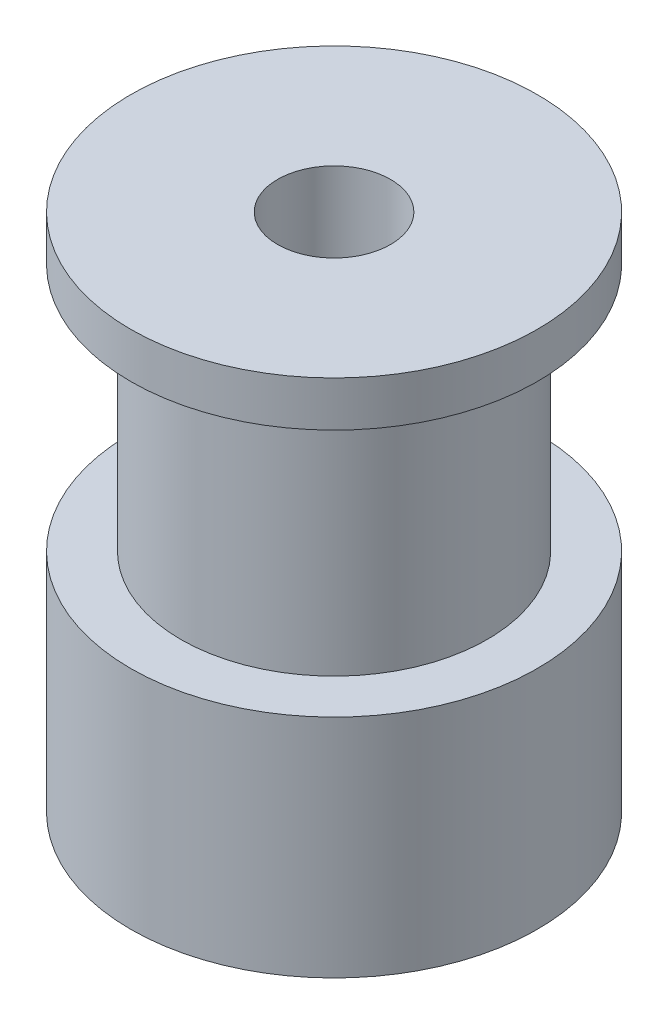
ISO-10303-21;
HEADER;
FILE_DESCRIPTION(('STEP AP214'),'2;1');
FILE_NAME('part.step','',(''),(''),'','','');
FILE_SCHEMA(('AUTOMOTIVE_DESIGN { 1 0 10303 214 1 1 1 1 }'));
ENDSEC;
DATA;
#1=APPLICATION_CONTEXT('core data for automotive mechanical design processes');
#2=APPLICATION_PROTOCOL_DEFINITION('international standard','automotive_design',2000,#1);
#3=PRODUCT_CONTEXT('',#1,'mechanical');
#4=PRODUCT('Part','Part','',(#3));
#5=PRODUCT_RELATED_PRODUCT_CATEGORY('part','',(#4));
#6=PRODUCT_DEFINITION_FORMATION('','',#4);
#7=PRODUCT_DEFINITION_CONTEXT('part definition',#1,'design');
#8=PRODUCT_DEFINITION('design','',#6,#7);
#9=PRODUCT_DEFINITION_SHAPE('','',#8);
#10=(LENGTH_UNIT() NAMED_UNIT(*) SI_UNIT(.MILLI.,.METRE.));
#11=(NAMED_UNIT(*) PLANE_ANGLE_UNIT() SI_UNIT($,.RADIAN.));
#12=(NAMED_UNIT(*) SI_UNIT($,.STERADIAN.) SOLID_ANGLE_UNIT());
#13=UNCERTAINTY_MEASURE_WITH_UNIT(LENGTH_MEASURE(1.E-05),#10,'distance_accuracy_value','');
#14=(GEOMETRIC_REPRESENTATION_CONTEXT(3) GLOBAL_UNCERTAINTY_ASSIGNED_CONTEXT((#13)) GLOBAL_UNIT_ASSIGNED_CONTEXT((#10,
#11,#12)) REPRESENTATION_CONTEXT('',''));
#15=CARTESIAN_POINT('',(0.,0.,0.));
#16=DIRECTION('',(0.,0.,1.));
#17=DIRECTION('',(1.,0.,0.));
#18=AXIS2_PLACEMENT_3D('',#15,#16,#17);
#19=CARTESIAN_POINT('',(0.,8.,0.));
#20=DIRECTION('',(0.,-1.,0.));
#21=DIRECTION('',(0.,0.,-1.));
#22=AXIS2_PLACEMENT_3D('',#19,#20,#21);
#23=CYLINDRICAL_SURFACE('',#22,9.);
#24=CARTESIAN_POINT('',(0.,0.,0.));
#25=DIRECTION('',(0.,1.,0.));
#26=DIRECTION('',(0.,0.,1.));
#27=AXIS2_PLACEMENT_3D('',#24,#25,#26);
#28=CIRCLE('',#27,9.);
#29=CARTESIAN_POINT('',(0.,0.,9.));
#30=VERTEX_POINT('',#29);
#31=EDGE_CURVE('E44',#30,#30,#28,.T.);
#32=ORIENTED_EDGE('',*,*,#31,.T.);
#33=EDGE_LOOP('',(#32));
#34=FACE_BOUND('',#33,.T.);
#35=CARTESIAN_POINT('',(0.,10.,0.));
#36=DIRECTION('',(0.,1.,0.));
#37=DIRECTION('',(0.,0.,1.));
#38=AXIS2_PLACEMENT_3D('',#35,#36,#37);
#39=CIRCLE('',#38,9.);
#40=CARTESIAN_POINT('',(0.,10.,9.));
#41=VERTEX_POINT('',#40);
#42=EDGE_CURVE('E54',#41,#41,#39,.T.);
#43=ORIENTED_EDGE('',*,*,#42,.F.);
#44=EDGE_LOOP('',(#43));
#45=FACE_BOUND('',#44,.T.);
#46=ADVANCED_FACE('F41',(#34,#45),#23,.T.);
#47=CARTESIAN_POINT('',(0.,0.,0.));
#48=DIRECTION('',(0.,1.,0.));
#49=DIRECTION('',(0.,0.,1.));
#50=AXIS2_PLACEMENT_3D('',#47,#48,#49);
#51=PLANE('',#50);
#52=CARTESIAN_POINT('',(0.,0.,0.));
#53=DIRECTION('',(0.,1.,0.));
#54=DIRECTION('',(0.,0.,1.));
#55=AXIS2_PLACEMENT_3D('',#52,#53,#54);
#56=CIRCLE('',#55,2.5);
#57=CARTESIAN_POINT('',(0.,0.,2.5));
#58=VERTEX_POINT('',#57);
#59=EDGE_CURVE('E75',#58,#58,#56,.T.);
#60=ORIENTED_EDGE('',*,*,#59,.T.);
#61=EDGE_LOOP('',(#60));
#62=FACE_BOUND('',#61,.T.);
#63=ORIENTED_EDGE('',*,*,#31,.F.);
#64=EDGE_LOOP('',(#63));
#65=FACE_BOUND('',#64,.T.);
#66=ADVANCED_FACE('F103',(#62,#65),#51,.F.);
#67=CARTESIAN_POINT('',(0.,10.,0.));
#68=DIRECTION('',(0.,1.,0.));
#69=DIRECTION('',(0.,0.,1.));
#70=AXIS2_PLACEMENT_3D('',#67,#68,#69);
#71=PLANE('',#70);
#72=CARTESIAN_POINT('',(0.,10.,0.));
#73=DIRECTION('',(0.,1.,0.));
#74=DIRECTION('',(0.,0.,1.));
#75=AXIS2_PLACEMENT_3D('',#72,#73,#74);
#76=CIRCLE('',#75,6.78);
#77=CARTESIAN_POINT('',(0.,10.,6.78));
#78=VERTEX_POINT('',#77);
#79=EDGE_CURVE('E10',#78,#78,#76,.T.);
#80=ORIENTED_EDGE('',*,*,#79,.F.);
#81=EDGE_LOOP('',(#80));
#82=FACE_BOUND('',#81,.T.);
#83=ORIENTED_EDGE('',*,*,#42,.T.);
#84=EDGE_LOOP('',(#83));
#85=FACE_BOUND('',#84,.T.);
#86=ADVANCED_FACE('F108',(#82,#85),#71,.T.);
#87=CARTESIAN_POINT('',(0.,21.,0.));
#88=DIRECTION('',(0.,-1.,0.));
#89=DIRECTION('',(0.,0.,-1.));
#90=AXIS2_PLACEMENT_3D('',#87,#88,#89);
#91=CYLINDRICAL_SURFACE('',#90,6.78);
#92=CARTESIAN_POINT('',(0.,21.,0.));
#93=DIRECTION('',(0.,1.,0.));
#94=DIRECTION('',(0.,0.,1.));
#95=AXIS2_PLACEMENT_3D('',#92,#93,#94);
#96=CIRCLE('',#95,6.78);
#97=CARTESIAN_POINT('',(0.,21.,6.78));
#98=VERTEX_POINT('',#97);
#99=EDGE_CURVE('E56',#98,#98,#96,.T.);
#100=ORIENTED_EDGE('',*,*,#99,.F.);
#101=EDGE_LOOP('',(#100));
#102=FACE_BOUND('',#101,.T.);
#103=ORIENTED_EDGE('',*,*,#79,.T.);
#104=EDGE_LOOP('',(#103));
#105=FACE_BOUND('',#104,.T.);
#106=ADVANCED_FACE('F98',(#102,#105),#91,.T.);
#107=CARTESIAN_POINT('',(0.,23.,0.));
#108=DIRECTION('',(0.,-1.,0.));
#109=DIRECTION('',(0.,0.,-1.));
#110=AXIS2_PLACEMENT_3D('',#107,#108,#109);
#111=CYLINDRICAL_SURFACE('',#110,9.);
#112=CARTESIAN_POINT('',(0.,23.,0.));
#113=DIRECTION('',(0.,1.,0.));
#114=DIRECTION('',(0.,0.,1.));
#115=AXIS2_PLACEMENT_3D('',#112,#113,#114);
#116=CIRCLE('',#115,9.);
#117=CARTESIAN_POINT('',(0.,23.,9.));
#118=VERTEX_POINT('',#117);
#119=EDGE_CURVE('E64',#118,#118,#116,.T.);
#120=ORIENTED_EDGE('',*,*,#119,.F.);
#121=EDGE_LOOP('',(#120));
#122=FACE_BOUND('',#121,.T.);
#123=CARTESIAN_POINT('',(0.,21.,0.));
#124=DIRECTION('',(0.,1.,0.));
#125=DIRECTION('',(0.,0.,1.));
#126=AXIS2_PLACEMENT_3D('',#123,#124,#125);
#127=CIRCLE('',#126,9.);
#128=CARTESIAN_POINT('',(0.,21.,9.));
#129=VERTEX_POINT('',#128);
#130=EDGE_CURVE('E69',#129,#129,#127,.T.);
#131=ORIENTED_EDGE('',*,*,#130,.T.);
#132=EDGE_LOOP('',(#131));
#133=FACE_BOUND('',#132,.T.);
#134=ADVANCED_FACE('F91',(#122,#133),#111,.T.);
#135=CARTESIAN_POINT('',(0.,23.,0.));
#136=DIRECTION('',(0.,1.,0.));
#137=DIRECTION('',(0.,0.,1.));
#138=AXIS2_PLACEMENT_3D('',#135,#136,#137);
#139=PLANE('',#138);
#140=CARTESIAN_POINT('',(0.,23.,0.));
#141=DIRECTION('',(0.,1.,0.));
#142=DIRECTION('',(0.,0.,1.));
#143=AXIS2_PLACEMENT_3D('',#140,#141,#142);
#144=CIRCLE('',#143,2.5);
#145=CARTESIAN_POINT('',(0.,23.,2.5));
#146=VERTEX_POINT('',#145);
#147=EDGE_CURVE('E80',#146,#146,#144,.T.);
#148=ORIENTED_EDGE('',*,*,#147,.F.);
#149=EDGE_LOOP('',(#148));
#150=FACE_BOUND('',#149,.T.);
#151=ORIENTED_EDGE('',*,*,#119,.T.);
#152=EDGE_LOOP('',(#151));
#153=FACE_BOUND('',#152,.T.);
#154=ADVANCED_FACE('F88',(#150,#153),#139,.T.);
#155=CARTESIAN_POINT('',(0.,21.,0.));
#156=DIRECTION('',(0.,1.,0.));
#157=DIRECTION('',(0.,0.,1.));
#158=AXIS2_PLACEMENT_3D('',#155,#156,#157);
#159=PLANE('',#158);
#160=ORIENTED_EDGE('',*,*,#99,.T.);
#161=EDGE_LOOP('',(#160));
#162=FACE_BOUND('',#161,.T.);
#163=ORIENTED_EDGE('',*,*,#130,.F.);
#164=EDGE_LOOP('',(#163));
#165=FACE_BOUND('',#164,.T.);
#166=ADVANCED_FACE('F90',(#162,#165),#159,.F.);
#167=CARTESIAN_POINT('',(0.,-8.,0.));
#168=DIRECTION('',(0.,1.,0.));
#169=DIRECTION('',(0.,0.,1.));
#170=AXIS2_PLACEMENT_3D('',#167,#168,#169);
#171=CYLINDRICAL_SURFACE('',#170,2.5);
#172=ORIENTED_EDGE('',*,*,#147,.T.);
#173=EDGE_LOOP('',(#172));
#174=FACE_BOUND('',#173,.T.);
#175=ORIENTED_EDGE('',*,*,#59,.F.);
#176=EDGE_LOOP('',(#175));
#177=FACE_BOUND('',#176,.T.);
#178=ADVANCED_FACE('F85',(#174,#177),#171,.F.);
#179=CLOSED_SHELL('',(#46,#66,#86,#106,#134,#154,#166,#178));
#180=MANIFOLD_SOLID_BREP('B2',#179);
#181=ADVANCED_BREP_SHAPE_REPRESENTATION('',(#18,#180),#14);
#182=SHAPE_DEFINITION_REPRESENTATION(#9,#181);
ENDSEC;
END-ISO-10303-21;
